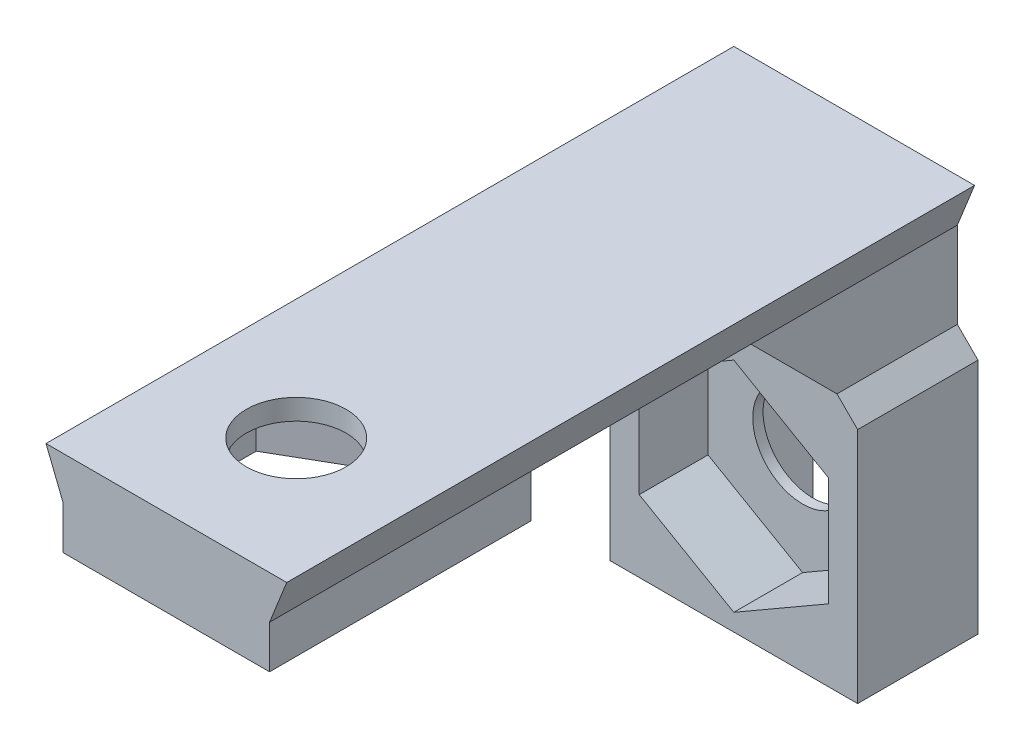
ISO-10303-21;
HEADER;
FILE_DESCRIPTION(('STEP AP214'),'2;1');
FILE_NAME('part.step','',(''),(''),'','','');
FILE_SCHEMA(('AUTOMOTIVE_DESIGN { 1 0 10303 214 1 1 1 1 }'));
ENDSEC;
DATA;
#1=APPLICATION_CONTEXT('core data for automotive mechanical design processes');
#2=APPLICATION_PROTOCOL_DEFINITION('international standard','automotive_design',2000,#1);
#3=PRODUCT_CONTEXT('',#1,'mechanical');
#4=PRODUCT('Part','Part','',(#3));
#5=PRODUCT_RELATED_PRODUCT_CATEGORY('part','',(#4));
#6=PRODUCT_DEFINITION_FORMATION('','',#4);
#7=PRODUCT_DEFINITION_CONTEXT('part definition',#1,'design');
#8=PRODUCT_DEFINITION('design','',#6,#7);
#9=PRODUCT_DEFINITION_SHAPE('','',#8);
#10=(LENGTH_UNIT() NAMED_UNIT(*) SI_UNIT(.MILLI.,.METRE.));
#11=(NAMED_UNIT(*) PLANE_ANGLE_UNIT() SI_UNIT($,.RADIAN.));
#12=(NAMED_UNIT(*) SI_UNIT($,.STERADIAN.) SOLID_ANGLE_UNIT());
#13=UNCERTAINTY_MEASURE_WITH_UNIT(LENGTH_MEASURE(1.E-05),#10,'distance_accuracy_value','');
#14=(GEOMETRIC_REPRESENTATION_CONTEXT(3) GLOBAL_UNCERTAINTY_ASSIGNED_CONTEXT((#13)) GLOBAL_UNIT_ASSIGNED_CONTEXT((#10,
#11,#12)) REPRESENTATION_CONTEXT('',''));
#15=CARTESIAN_POINT('',(0.,0.,0.));
#16=DIRECTION('',(0.,0.,1.));
#17=DIRECTION('',(1.,0.,0.));
#18=AXIS2_PLACEMENT_3D('',#15,#16,#17);
#19=CARTESIAN_POINT('',(-6.,20.,3.5));
#20=DIRECTION('',(0.,0.,-1.));
#21=DIRECTION('',(-1.,0.,0.));
#22=AXIS2_PLACEMENT_3D('',#19,#20,#21);
#23=PLANE('',#22);
#24=DIRECTION('',(-0.866025403784438,-0.5,0.));
#25=VECTOR('',#24,1.);
#26=CARTESIAN_POINT('',(0.,13.7008529610859,3.5));
#27=LINE('',#26,#25);
#28=CARTESIAN_POINT('',(0.,13.7008529610859,3.5));
#29=VERTEX_POINT('',#28);
#30=CARTESIAN_POINT('',(-5.50000000000001,10.5254264805429,3.5));
#31=VERTEX_POINT('',#30);
#32=EDGE_CURVE('E451',#29,#31,#27,.T.);
#33=ORIENTED_EDGE('',*,*,#32,.F.);
#34=DIRECTION('',(-0.866025403784439,0.499999999999999,0.));
#35=VECTOR('',#34,1.);
#36=CARTESIAN_POINT('',(5.50000000000001,10.525426480543,3.5));
#37=LINE('',#36,#35);
#38=CARTESIAN_POINT('',(5.50000000000001,10.525426480543,3.5));
#39=VERTEX_POINT('',#38);
#40=EDGE_CURVE('E448',#39,#29,#37,.T.);
#41=ORIENTED_EDGE('',*,*,#40,.F.);
#42=DIRECTION('',(0.,1.,0.));
#43=VECTOR('',#42,1.);
#44=CARTESIAN_POINT('',(5.5,4.17457351945706,3.5));
#45=LINE('',#44,#43);
#46=CARTESIAN_POINT('',(5.5,4.17457351945706,3.5));
#47=VERTEX_POINT('',#46);
#48=EDGE_CURVE('E347',#47,#39,#45,.T.);
#49=ORIENTED_EDGE('',*,*,#48,.F.);
#50=DIRECTION('',(0.866025403784438,0.500000000000002,0.));
#51=VECTOR('',#50,1.);
#52=CARTESIAN_POINT('',(0.,0.999147038914107,3.5));
#53=LINE('',#52,#51);
#54=CARTESIAN_POINT('',(0.,0.999147038914107,3.5));
#55=VERTEX_POINT('',#54);
#56=EDGE_CURVE('E462',#55,#47,#53,.T.);
#57=ORIENTED_EDGE('',*,*,#56,.F.);
#58=DIRECTION('',(0.866025403784439,-0.499999999999999,0.));
#59=VECTOR('',#58,1.);
#60=CARTESIAN_POINT('',(-5.50000000000001,4.17457351945705,3.5));
#61=LINE('',#60,#59);
#62=CARTESIAN_POINT('',(-5.50000000000001,4.17457351945705,3.5));
#63=VERTEX_POINT('',#62);
#64=EDGE_CURVE('E459',#63,#55,#61,.T.);
#65=ORIENTED_EDGE('',*,*,#64,.F.);
#66=DIRECTION('',(0.,-1.,0.));
#67=VECTOR('',#66,1.);
#68=CARTESIAN_POINT('',(-5.50000000000001,10.5254264805429,3.5));
#69=LINE('',#68,#67);
#70=EDGE_CURVE('E455',#31,#63,#69,.T.);
#71=ORIENTED_EDGE('',*,*,#70,.F.);
#72=EDGE_LOOP('',(#33,#41,#49,#57,#65,#71));
#73=FACE_BOUND('',#72,.T.);
#74=DIRECTION('',(1.,0.,0.));
#75=VECTOR('',#74,1.);
#76=CARTESIAN_POINT('',(-6.,15.,3.5));
#77=LINE('',#76,#75);
#78=CARTESIAN_POINT('',(-6.,15.,3.5));
#79=VERTEX_POINT('',#78);
#80=CARTESIAN_POINT('',(6.,15.,3.5));
#81=VERTEX_POINT('',#80);
#82=EDGE_CURVE('E236',#79,#81,#77,.T.);
#83=ORIENTED_EDGE('',*,*,#82,.F.);
#84=DIRECTION('',(0.707106781186548,0.707106781186548,0.));
#85=VECTOR('',#84,1.);
#86=CARTESIAN_POINT('',(-7.2,13.8,3.5));
#87=LINE('',#86,#85);
#88=CARTESIAN_POINT('',(-7.2,13.8,3.5));
#89=VERTEX_POINT('',#88);
#90=EDGE_CURVE('E246',#79,#89,#87,.F.);
#91=ORIENTED_EDGE('',*,*,#90,.T.);
#92=DIRECTION('',(0.,-1.,0.));
#93=VECTOR('',#92,1.);
#94=CARTESIAN_POINT('',(-7.2,15.,3.5));
#95=LINE('',#94,#93);
#96=CARTESIAN_POINT('',(-7.2,0.,3.5));
#97=VERTEX_POINT('',#96);
#98=EDGE_CURVE('E262',#89,#97,#95,.T.);
#99=ORIENTED_EDGE('',*,*,#98,.T.);
#100=DIRECTION('',(1.,0.,0.));
#101=VECTOR('',#100,1.);
#102=CARTESIAN_POINT('',(-6.,0.,3.5));
#103=LINE('',#102,#101);
#104=CARTESIAN_POINT('',(7.2,0.,3.5));
#105=VERTEX_POINT('',#104);
#106=EDGE_CURVE('E300',#97,#105,#103,.T.);
#107=ORIENTED_EDGE('',*,*,#106,.T.);
#108=DIRECTION('',(0.,-1.,0.));
#109=VECTOR('',#108,1.);
#110=CARTESIAN_POINT('',(7.2,15.,3.5));
#111=LINE('',#110,#109);
#112=CARTESIAN_POINT('',(7.2,13.8,3.5));
#113=VERTEX_POINT('',#112);
#114=EDGE_CURVE('E1030',#113,#105,#111,.T.);
#115=ORIENTED_EDGE('',*,*,#114,.F.);
#116=DIRECTION('',(-0.707106781186548,0.707106781186547,0.));
#117=VECTOR('',#116,1.);
#118=CARTESIAN_POINT('',(7.2,13.8,3.5));
#119=LINE('',#118,#117);
#120=EDGE_CURVE('E249',#113,#81,#119,.T.);
#121=ORIENTED_EDGE('',*,*,#120,.T.);
#122=EDGE_LOOP('',(#83,#91,#99,#107,#115,#121));
#123=FACE_BOUND('',#122,.T.);
#124=ADVANCED_FACE('F39',(#73,#123),#23,.F.);
#125=CARTESIAN_POINT('',(6.,20.,3.5));
#126=DIRECTION('',(-1.,0.,0.));
#127=DIRECTION('',(0.,0.,1.));
#128=AXIS2_PLACEMENT_3D('',#125,#126,#127);
#129=PLANE('',#128);
#130=DIRECTION('',(0.,0.,-1.));
#131=VECTOR('',#130,1.);
#132=CARTESIAN_POINT('',(6.,20.,3.5));
#133=LINE('',#132,#131);
#134=CARTESIAN_POINT('',(6.,20.,8.49999999999987));
#135=VERTEX_POINT('',#134);
#136=CARTESIAN_POINT('',(6.,20.,-3.5));
#137=VERTEX_POINT('',#136);
#138=EDGE_CURVE('E294',#135,#137,#133,.T.);
#139=ORIENTED_EDGE('',*,*,#138,.F.);
#140=DIRECTION('',(0.,-0.707106781186551,-0.707106781186544));
#141=VECTOR('',#140,1.);
#142=CARTESIAN_POINT('',(6.,25.0000000000002,13.5));
#143=LINE('',#142,#141);
#144=EDGE_CURVE('E242',#135,#81,#143,.T.);
#145=ORIENTED_EDGE('',*,*,#144,.T.);
#146=DIRECTION('',(0.,0.,-1.));
#147=VECTOR('',#146,1.);
#148=CARTESIAN_POINT('',(6.,15.,3.5));
#149=LINE('',#148,#147);
#150=CARTESIAN_POINT('',(6.,15.,-3.5));
#151=VERTEX_POINT('',#150);
#152=EDGE_CURVE('E292',#81,#151,#149,.T.);
#153=ORIENTED_EDGE('',*,*,#152,.T.);
#154=DIRECTION('',(0.,-1.,0.));
#155=VECTOR('',#154,1.);
#156=CARTESIAN_POINT('',(6.,20.,-3.5));
#157=LINE('',#156,#155);
#158=EDGE_CURVE('E277',#137,#151,#157,.T.);
#159=ORIENTED_EDGE('',*,*,#158,.F.);
#160=EDGE_LOOP('',(#139,#145,#153,#159));
#161=FACE_BOUND('',#160,.T.);
#162=ADVANCED_FACE('F290',(#161),#129,.F.);
#163=CARTESIAN_POINT('',(0.,17.5,0.));
#164=DIRECTION('',(0.,1.,0.));
#165=DIRECTION('',(0.,0.,1.));
#166=AXIS2_PLACEMENT_3D('',#163,#164,#165);
#167=PLANE('',#166);
#168=DIRECTION('',(0.,0.,-1.));
#169=VECTOR('',#168,1.);
#170=CARTESIAN_POINT('',(-6.,17.5,21.3));
#171=LINE('',#170,#169);
#172=CARTESIAN_POINT('',(-6.,17.5,36.5));
#173=VERTEX_POINT('',#172);
#174=CARTESIAN_POINT('',(-6.,17.5,21.3));
#175=VERTEX_POINT('',#174);
#176=EDGE_CURVE('E941',#173,#175,#171,.T.);
#177=ORIENTED_EDGE('',*,*,#176,.T.);
#178=DIRECTION('',(1.,0.,0.));
#179=VECTOR('',#178,1.);
#180=CARTESIAN_POINT('',(-6.,17.5,21.3));
#181=LINE('',#180,#179);
#182=CARTESIAN_POINT('',(6.,17.5,21.3));
#183=VERTEX_POINT('',#182);
#184=EDGE_CURVE('E945',#175,#183,#181,.T.);
#185=ORIENTED_EDGE('',*,*,#184,.T.);
#186=DIRECTION('',(0.,0.,1.));
#187=VECTOR('',#186,1.);
#188=CARTESIAN_POINT('',(6.,17.5,21.3));
#189=LINE('',#188,#187);
#190=CARTESIAN_POINT('',(6.,17.5,36.5));
#191=VERTEX_POINT('',#190);
#192=EDGE_CURVE('E948',#183,#191,#189,.T.);
#193=ORIENTED_EDGE('',*,*,#192,.T.);
#194=DIRECTION('',(-1.,0.,0.));
#195=VECTOR('',#194,1.);
#196=CARTESIAN_POINT('',(-6.,17.5,36.5));
#197=LINE('',#196,#195);
#198=EDGE_CURVE('E951',#191,#173,#197,.T.);
#199=ORIENTED_EDGE('',*,*,#198,.T.);
#200=EDGE_LOOP('',(#177,#185,#193,#199));
#201=FACE_BOUND('',#200,.T.);
#202=DIRECTION('',(0.866025403784439,0.,-0.5));
#203=VECTOR('',#202,1.);
#204=CARTESIAN_POINT('',(-5.5,17.5,25.7745735194571));
#205=LINE('',#204,#203);
#206=CARTESIAN_POINT('',(-5.5,17.5,25.7745735194571));
#207=VERTEX_POINT('',#206);
#208=CARTESIAN_POINT('',(0.,17.5,22.5991470389141));
#209=VERTEX_POINT('',#208);
#210=EDGE_CURVE('E903',#207,#209,#205,.T.);
#211=ORIENTED_EDGE('',*,*,#210,.F.);
#212=DIRECTION('',(0.,0.,-1.));
#213=VECTOR('',#212,1.);
#214=CARTESIAN_POINT('',(-5.5,17.5,32.1254264805429));
#215=LINE('',#214,#213);
#216=CARTESIAN_POINT('',(-5.5,17.5,32.1254264805429));
#217=VERTEX_POINT('',#216);
#218=EDGE_CURVE('E919',#217,#207,#215,.T.);
#219=ORIENTED_EDGE('',*,*,#218,.F.);
#220=DIRECTION('',(-0.866025403784439,0.,-0.5));
#221=VECTOR('',#220,1.);
#222=CARTESIAN_POINT('',(0.,17.5,35.3008529610859));
#223=LINE('',#222,#221);
#224=CARTESIAN_POINT('',(0.,17.5,35.3008529610859));
#225=VERTEX_POINT('',#224);
#226=EDGE_CURVE('E915',#225,#217,#223,.T.);
#227=ORIENTED_EDGE('',*,*,#226,.F.);
#228=DIRECTION('',(-0.866025403784438,0.,0.5));
#229=VECTOR('',#228,1.);
#230=CARTESIAN_POINT('',(5.5,17.5,32.1254264805429));
#231=LINE('',#230,#229);
#232=CARTESIAN_POINT('',(5.5,17.5,32.1254264805429));
#233=VERTEX_POINT('',#232);
#234=EDGE_CURVE('E912',#233,#225,#231,.T.);
#235=ORIENTED_EDGE('',*,*,#234,.F.);
#236=DIRECTION('',(0.,0.,1.));
#237=VECTOR('',#236,1.);
#238=CARTESIAN_POINT('',(5.50000000000001,17.5,25.7745735194571));
#239=LINE('',#238,#237);
#240=CARTESIAN_POINT('',(5.50000000000001,17.5,25.7745735194571));
#241=VERTEX_POINT('',#240);
#242=EDGE_CURVE('E909',#241,#233,#239,.T.);
#243=ORIENTED_EDGE('',*,*,#242,.F.);
#244=DIRECTION('',(0.866025403784439,0.,0.5));
#245=VECTOR('',#244,1.);
#246=CARTESIAN_POINT('',(0.,17.5,22.5991470389141));
#247=LINE('',#246,#245);
#248=EDGE_CURVE('E906',#209,#241,#247,.T.);
#249=ORIENTED_EDGE('',*,*,#248,.F.);
#250=EDGE_LOOP('',(#211,#219,#227,#235,#243,#249));
#251=FACE_BOUND('',#250,.T.);
#252=ADVANCED_FACE('F505',(#201,#251),#167,.F.);
#253=CARTESIAN_POINT('',(0.,20.,0.));
#254=DIRECTION('',(0.,1.,0.));
#255=DIRECTION('',(0.,0.,1.));
#256=AXIS2_PLACEMENT_3D('',#253,#254,#255);
#257=PLANE('',#256);
#258=DIRECTION('',(0.,0.,-1.));
#259=VECTOR('',#258,1.);
#260=CARTESIAN_POINT('',(-6.,20.,36.501));
#261=LINE('',#260,#259);
#262=CARTESIAN_POINT('',(-6.,20.,21.3));
#263=VERTEX_POINT('',#262);
#264=CARTESIAN_POINT('',(-6.,20.,8.49999999999988));
#265=VERTEX_POINT('',#264);
#266=EDGE_CURVE('E54',#263,#265,#261,.T.);
#267=ORIENTED_EDGE('',*,*,#266,.T.);
#268=DIRECTION('',(1.,0.,0.));
#269=VECTOR('',#268,1.);
#270=CARTESIAN_POINT('',(0.,20.,8.49999999999988));
#271=LINE('',#270,#269);
#272=EDGE_CURVE('E11',#265,#135,#271,.T.);
#273=ORIENTED_EDGE('',*,*,#272,.T.);
#274=CARTESIAN_POINT('',(6.,20.,21.3));
#275=VERTEX_POINT('',#274);
#276=EDGE_CURVE('E299',#275,#135,#133,.T.);
#277=ORIENTED_EDGE('',*,*,#276,.F.);
#278=DIRECTION('',(1.,0.,0.));
#279=VECTOR('',#278,1.);
#280=CARTESIAN_POINT('',(-6.,20.,21.3));
#281=LINE('',#280,#279);
#282=EDGE_CURVE('E940',#263,#275,#281,.T.);
#283=ORIENTED_EDGE('',*,*,#282,.F.);
#284=EDGE_LOOP('',(#267,#273,#277,#283));
#285=FACE_BOUND('',#284,.T.);
#286=ADVANCED_FACE('F576',(#285),#257,.F.);
#287=CARTESIAN_POINT('',(0.,7.35,-3.501));
#288=DIRECTION('',(0.,0.,1.));
#289=DIRECTION('',(1.,0.,0.));
#290=AXIS2_PLACEMENT_3D('',#287,#288,#289);
#291=CYLINDRICAL_SURFACE('',#290,2.9);
#292=CARTESIAN_POINT('',(0.,7.35,-1.1));
#293=DIRECTION('',(0.,0.,1.));
#294=DIRECTION('',(1.,0.,0.));
#295=AXIS2_PLACEMENT_3D('',#292,#293,#294);
#296=CIRCLE('',#295,2.9);
#297=CARTESIAN_POINT('',(2.9,7.35,-1.1));
#298=VERTEX_POINT('',#297);
#299=EDGE_CURVE('E329',#298,#298,#296,.F.);
#300=ORIENTED_EDGE('',*,*,#299,.T.);
#301=EDGE_LOOP('',(#300));
#302=FACE_BOUND('',#301,.T.);
#303=CARTESIAN_POINT('',(0.,7.35,-0.500000000000002));
#304=DIRECTION('',(0.,0.,1.));
#305=DIRECTION('',(1.,0.,0.));
#306=AXIS2_PLACEMENT_3D('',#303,#304,#305);
#307=CIRCLE('',#306,2.9);
#308=CARTESIAN_POINT('',(2.9,7.35,-0.500000000000002));
#309=VERTEX_POINT('',#308);
#310=EDGE_CURVE('E326',#309,#309,#307,.F.);
#311=ORIENTED_EDGE('',*,*,#310,.F.);
#312=EDGE_LOOP('',(#311));
#313=FACE_BOUND('',#312,.T.);
#314=ADVANCED_FACE('F514',(#302,#313),#291,.F.);
#315=CARTESIAN_POINT('',(-6.,20.,-3.5));
#316=DIRECTION('',(0.,0.,1.));
#317=DIRECTION('',(1.,0.,0.));
#318=AXIS2_PLACEMENT_3D('',#315,#316,#317);
#319=PLANE('',#318);
#320=ORIENTED_EDGE('',*,*,#158,.T.);
#321=DIRECTION('',(0.707106781186548,-0.707106781186547,0.));
#322=VECTOR('',#321,1.);
#323=CARTESIAN_POINT('',(7.2,13.8,-3.5));
#324=LINE('',#323,#322);
#325=CARTESIAN_POINT('',(7.2,13.8,-3.5));
#326=VERTEX_POINT('',#325);
#327=EDGE_CURVE('E283',#151,#326,#324,.T.);
#328=ORIENTED_EDGE('',*,*,#327,.T.);
#329=DIRECTION('',(0.,-1.,0.));
#330=VECTOR('',#329,1.);
#331=CARTESIAN_POINT('',(7.2,15.,-3.5));
#332=LINE('',#331,#330);
#333=CARTESIAN_POINT('',(7.2,0.,-3.5));
#334=VERTEX_POINT('',#333);
#335=EDGE_CURVE('E1031',#326,#334,#332,.T.);
#336=ORIENTED_EDGE('',*,*,#335,.T.);
#337=DIRECTION('',(-1.,0.,0.));
#338=VECTOR('',#337,1.);
#339=CARTESIAN_POINT('',(-6.,0.,-3.5));
#340=LINE('',#339,#338);
#341=CARTESIAN_POINT('',(2.4,0.,-3.5));
#342=VERTEX_POINT('',#341);
#343=EDGE_CURVE('E315',#334,#342,#340,.T.);
#344=ORIENTED_EDGE('',*,*,#343,.T.);
#345=DIRECTION('',(0.,1.,0.));
#346=VECTOR('',#345,1.);
#347=CARTESIAN_POINT('',(2.4,0.,-3.5));
#348=LINE('',#347,#346);
#349=CARTESIAN_POINT('',(2.4,20.,-3.5));
#350=VERTEX_POINT('',#349);
#351=EDGE_CURVE('E385',#342,#350,#348,.T.);
#352=ORIENTED_EDGE('',*,*,#351,.T.);
#353=DIRECTION('',(-1.,0.,0.));
#354=VECTOR('',#353,1.);
#355=CARTESIAN_POINT('',(-7.,20.,-3.5));
#356=LINE('',#355,#354);
#357=CARTESIAN_POINT('',(-2.4,20.,-3.5));
#358=VERTEX_POINT('',#357);
#359=EDGE_CURVE('E409',#350,#358,#356,.T.);
#360=ORIENTED_EDGE('',*,*,#359,.T.);
#361=DIRECTION('',(0.,1.,0.));
#362=VECTOR('',#361,1.);
#363=CARTESIAN_POINT('',(-2.4,0.,-3.5));
#364=LINE('',#363,#362);
#365=CARTESIAN_POINT('',(-2.4,0.,-3.5));
#366=VERTEX_POINT('',#365);
#367=EDGE_CURVE('E312',#366,#358,#364,.T.);
#368=ORIENTED_EDGE('',*,*,#367,.F.);
#369=CARTESIAN_POINT('',(-7.2,0.,-3.5));
#370=VERTEX_POINT('',#369);
#371=EDGE_CURVE('E319',#366,#370,#340,.T.);
#372=ORIENTED_EDGE('',*,*,#371,.T.);
#373=DIRECTION('',(0.,-1.,0.));
#374=VECTOR('',#373,1.);
#375=CARTESIAN_POINT('',(-7.2,15.,-3.5));
#376=LINE('',#375,#374);
#377=CARTESIAN_POINT('',(-7.2,13.8,-3.5));
#378=VERTEX_POINT('',#377);
#379=EDGE_CURVE('E864',#378,#370,#376,.T.);
#380=ORIENTED_EDGE('',*,*,#379,.F.);
#381=DIRECTION('',(-0.707106781186548,-0.707106781186548,0.));
#382=VECTOR('',#381,1.);
#383=CARTESIAN_POINT('',(-7.2,13.8,-3.5));
#384=LINE('',#383,#382);
#385=CARTESIAN_POINT('',(-6.,15.,-3.5));
#386=VERTEX_POINT('',#385);
#387=EDGE_CURVE('E274',#378,#386,#384,.F.);
#388=ORIENTED_EDGE('',*,*,#387,.T.);
#389=DIRECTION('',(0.,-1.,0.));
#390=VECTOR('',#389,1.);
#391=CARTESIAN_POINT('',(-6.,20.,-3.5));
#392=LINE('',#391,#390);
#393=CARTESIAN_POINT('',(-6.,20.,-3.5));
#394=VERTEX_POINT('',#393);
#395=EDGE_CURVE('E259',#394,#386,#392,.T.);
#396=ORIENTED_EDGE('',*,*,#395,.F.);
#397=DIRECTION('',(0.371390676354104,-0.928476690885259,0.));
#398=VECTOR('',#397,1.);
#399=CARTESIAN_POINT('',(-6.,20.,-3.5));
#400=LINE('',#399,#398);
#401=CARTESIAN_POINT('',(-7.,22.5,-3.5));
#402=VERTEX_POINT('',#401);
#403=EDGE_CURVE('E970',#402,#394,#400,.T.);
#404=ORIENTED_EDGE('',*,*,#403,.F.);
#405=DIRECTION('',(-1.,0.,0.));
#406=VECTOR('',#405,1.);
#407=CARTESIAN_POINT('',(-7.,22.5,-3.5));
#408=LINE('',#407,#406);
#409=CARTESIAN_POINT('',(7.,22.5,-3.5));
#410=VERTEX_POINT('',#409);
#411=EDGE_CURVE('E423',#410,#402,#408,.T.);
#412=ORIENTED_EDGE('',*,*,#411,.F.);
#413=DIRECTION('',(0.371390676354104,0.928476690885259,0.));
#414=VECTOR('',#413,1.);
#415=CARTESIAN_POINT('',(7.,22.5,-3.5));
#416=LINE('',#415,#414);
#417=EDGE_CURVE('E971',#137,#410,#416,.T.);
#418=ORIENTED_EDGE('',*,*,#417,.F.);
#419=EDGE_LOOP('',(#320,#328,#336,#344,#352,#360,#368,#372,#380,#388,#396,#404,#412,#418));
#420=FACE_BOUND('',#419,.T.);
#421=ADVANCED_FACE('F410',(#420),#319,.F.);
#422=CARTESIAN_POINT('',(-6.,20.,3.5));
#423=DIRECTION('',(1.,0.,0.));
#424=DIRECTION('',(0.,0.,-1.));
#425=AXIS2_PLACEMENT_3D('',#422,#423,#424);
#426=PLANE('',#425);
#427=DIRECTION('',(0.,0.,1.));
#428=VECTOR('',#427,1.);
#429=CARTESIAN_POINT('',(-6.,15.,3.5));
#430=LINE('',#429,#428);
#431=EDGE_CURVE('E256',#386,#79,#430,.T.);
#432=ORIENTED_EDGE('',*,*,#431,.T.);
#433=DIRECTION('',(0.,0.707106781186551,0.707106781186544));
#434=VECTOR('',#433,1.);
#435=CARTESIAN_POINT('',(-6.,25.0000000000002,13.5));
#436=LINE('',#435,#434);
#437=EDGE_CURVE('E48',#79,#265,#436,.T.);
#438=ORIENTED_EDGE('',*,*,#437,.T.);
#439=DIRECTION('',(0.,0.,1.));
#440=VECTOR('',#439,1.);
#441=CARTESIAN_POINT('',(-6.,20.,3.5));
#442=LINE('',#441,#440);
#443=EDGE_CURVE('E308',#394,#265,#442,.T.);
#444=ORIENTED_EDGE('',*,*,#443,.F.);
#445=ORIENTED_EDGE('',*,*,#395,.T.);
#446=EDGE_LOOP('',(#432,#438,#444,#445));
#447=FACE_BOUND('',#446,.T.);
#448=ADVANCED_FACE('F257',(#447),#426,.F.);
#449=CARTESIAN_POINT('',(0.,0.,0.));
#450=DIRECTION('',(0.,-1.,0.));
#451=DIRECTION('',(0.,0.,-1.));
#452=AXIS2_PLACEMENT_3D('',#449,#450,#451);
#453=PLANE('',#452);
#454=DIRECTION('',(-0.707106781186546,0.,-0.707106781186549));
#455=VECTOR('',#454,1.);
#456=CARTESIAN_POINT('',(2.4,0.,-3.5));
#457=LINE('',#456,#455);
#458=CARTESIAN_POINT('',(4.79999999999999,0.,-1.1));
#459=VERTEX_POINT('',#458);
#460=EDGE_CURVE('E372',#459,#342,#457,.T.);
#461=ORIENTED_EDGE('',*,*,#460,.T.);
#462=ORIENTED_EDGE('',*,*,#343,.F.);
#463=DIRECTION('',(0.,0.,1.));
#464=VECTOR('',#463,1.);
#465=CARTESIAN_POINT('',(7.2,0.,3.5));
#466=LINE('',#465,#464);
#467=EDGE_CURVE('E252',#334,#105,#466,.T.);
#468=ORIENTED_EDGE('',*,*,#467,.T.);
#469=ORIENTED_EDGE('',*,*,#106,.F.);
#470=DIRECTION('',(0.,0.,-1.));
#471=VECTOR('',#470,1.);
#472=CARTESIAN_POINT('',(-7.2,0.,3.5));
#473=LINE('',#472,#471);
#474=EDGE_CURVE('E263',#97,#370,#473,.T.);
#475=ORIENTED_EDGE('',*,*,#474,.T.);
#476=ORIENTED_EDGE('',*,*,#371,.F.);
#477=DIRECTION('',(-0.707106781186551,0.,0.707106781186544));
#478=VECTOR('',#477,1.);
#479=CARTESIAN_POINT('',(-2.4,0.,-3.5));
#480=LINE('',#479,#478);
#481=CARTESIAN_POINT('',(-4.80000000000002,0.,-1.1));
#482=VERTEX_POINT('',#481);
#483=EDGE_CURVE('E363',#366,#482,#480,.T.);
#484=ORIENTED_EDGE('',*,*,#483,.T.);
#485=DIRECTION('',(1.,0.,0.));
#486=VECTOR('',#485,1.);
#487=CARTESIAN_POINT('',(0.,0.,-1.1));
#488=LINE('',#487,#486);
#489=EDGE_CURVE('E367',#482,#459,#488,.T.);
#490=ORIENTED_EDGE('',*,*,#489,.T.);
#491=EDGE_LOOP('',(#461,#462,#468,#469,#475,#476,#484,#490));
#492=FACE_BOUND('',#491,.T.);
#493=ADVANCED_FACE('F509',(#492),#453,.T.);
#494=CARTESIAN_POINT('',(2.4,0.,-3.5));
#495=DIRECTION('',(0.707106781186549,0.,-0.707106781186546));
#496=DIRECTION('',(-0.707106781186546,0.,-0.707106781186549));
#497=AXIS2_PLACEMENT_3D('',#494,#495,#496);
#498=PLANE('',#497);
#499=DIRECTION('',(-0.707106781186546,0.,-0.707106781186549));
#500=VECTOR('',#499,1.);
#501=CARTESIAN_POINT('',(2.4,20.,-3.5));
#502=LINE('',#501,#500);
#503=CARTESIAN_POINT('',(4.79999999999999,20.,-1.1));
#504=VERTEX_POINT('',#503);
#505=EDGE_CURVE('E368',#504,#350,#502,.T.);
#506=ORIENTED_EDGE('',*,*,#505,.T.);
#507=ORIENTED_EDGE('',*,*,#351,.F.);
#508=ORIENTED_EDGE('',*,*,#460,.F.);
#509=DIRECTION('',(0.,1.,0.));
#510=VECTOR('',#509,1.);
#511=CARTESIAN_POINT('',(4.79999999999999,0.,-1.1));
#512=LINE('',#511,#510);
#513=EDGE_CURVE('E389',#459,#504,#512,.T.);
#514=ORIENTED_EDGE('',*,*,#513,.T.);
#515=EDGE_LOOP('',(#506,#507,#508,#514));
#516=FACE_BOUND('',#515,.T.);
#517=ADVANCED_FACE('F628',(#516),#498,.F.);
#518=CARTESIAN_POINT('',(0.,0.,-1.1));
#519=DIRECTION('',(0.,0.,1.));
#520=DIRECTION('',(1.,0.,0.));
#521=AXIS2_PLACEMENT_3D('',#518,#519,#520);
#522=PLANE('',#521);
#523=ORIENTED_EDGE('',*,*,#299,.F.);
#524=EDGE_LOOP('',(#523));
#525=FACE_BOUND('',#524,.T.);
#526=DIRECTION('',(1.,0.,0.));
#527=VECTOR('',#526,1.);
#528=CARTESIAN_POINT('',(0.,20.,-1.1));
#529=LINE('',#528,#527);
#530=CARTESIAN_POINT('',(-4.80000000000002,20.,-1.1));
#531=VERTEX_POINT('',#530);
#532=EDGE_CURVE('E379',#531,#504,#529,.T.);
#533=ORIENTED_EDGE('',*,*,#532,.T.);
#534=ORIENTED_EDGE('',*,*,#513,.F.);
#535=ORIENTED_EDGE('',*,*,#489,.F.);
#536=DIRECTION('',(0.,1.,0.));
#537=VECTOR('',#536,1.);
#538=CARTESIAN_POINT('',(-4.80000000000002,0.,-1.1));
#539=LINE('',#538,#537);
#540=EDGE_CURVE('E391',#482,#531,#539,.T.);
#541=ORIENTED_EDGE('',*,*,#540,.T.);
#542=EDGE_LOOP('',(#533,#534,#535,#541));
#543=FACE_BOUND('',#542,.T.);
#544=ADVANCED_FACE('F776',(#525,#543),#522,.F.);
#545=CARTESIAN_POINT('',(-2.4,0.,-3.5));
#546=DIRECTION('',(-0.707106781186544,0.,-0.707106781186551));
#547=DIRECTION('',(-0.707106781186551,0.,0.707106781186544));
#548=AXIS2_PLACEMENT_3D('',#545,#546,#547);
#549=PLANE('',#548);
#550=DIRECTION('',(-0.707106781186551,0.,0.707106781186544));
#551=VECTOR('',#550,1.);
#552=CARTESIAN_POINT('',(-2.4,20.,-3.5));
#553=LINE('',#552,#551);
#554=EDGE_CURVE('E336',#358,#531,#553,.T.);
#555=ORIENTED_EDGE('',*,*,#554,.T.);
#556=ORIENTED_EDGE('',*,*,#540,.F.);
#557=ORIENTED_EDGE('',*,*,#483,.F.);
#558=ORIENTED_EDGE('',*,*,#367,.T.);
#559=EDGE_LOOP('',(#555,#556,#557,#558));
#560=FACE_BOUND('',#559,.T.);
#561=ADVANCED_FACE('F399',(#560),#549,.F.);
#562=CARTESIAN_POINT('',(0.,0.,-0.500000000000002));
#563=DIRECTION('',(0.,0.,1.));
#564=DIRECTION('',(1.,0.,0.));
#565=AXIS2_PLACEMENT_3D('',#562,#563,#564);
#566=PLANE('',#565);
#567=DIRECTION('',(-0.866025403784439,0.499999999999999,0.));
#568=VECTOR('',#567,1.);
#569=CARTESIAN_POINT('',(5.50000000000001,10.525426480543,-0.500000000000002));
#570=LINE('',#569,#568);
#571=CARTESIAN_POINT('',(5.50000000000001,10.525426480543,-0.500000000000002));
#572=VERTEX_POINT('',#571);
#573=CARTESIAN_POINT('',(0.,13.7008529610859,-0.500000000000002));
#574=VERTEX_POINT('',#573);
#575=EDGE_CURVE('E425',#572,#574,#570,.T.);
#576=ORIENTED_EDGE('',*,*,#575,.T.);
#577=DIRECTION('',(-0.866025403784438,-0.5,0.));
#578=VECTOR('',#577,1.);
#579=CARTESIAN_POINT('',(0.,13.7008529610859,-0.500000000000002));
#580=LINE('',#579,#578);
#581=CARTESIAN_POINT('',(-5.50000000000001,10.5254264805429,-0.500000000000002));
#582=VERTEX_POINT('',#581);
#583=EDGE_CURVE('E429',#574,#582,#580,.T.);
#584=ORIENTED_EDGE('',*,*,#583,.T.);
#585=DIRECTION('',(0.,-1.,0.));
#586=VECTOR('',#585,1.);
#587=CARTESIAN_POINT('',(-5.50000000000001,10.5254264805429,-0.500000000000002));
#588=LINE('',#587,#586);
#589=CARTESIAN_POINT('',(-5.50000000000001,4.17457351945705,-0.500000000000002));
#590=VERTEX_POINT('',#589);
#591=EDGE_CURVE('E433',#582,#590,#588,.T.);
#592=ORIENTED_EDGE('',*,*,#591,.T.);
#593=DIRECTION('',(0.866025403784439,-0.499999999999999,0.));
#594=VECTOR('',#593,1.);
#595=CARTESIAN_POINT('',(-5.50000000000001,4.17457351945705,-0.500000000000002));
#596=LINE('',#595,#594);
#597=CARTESIAN_POINT('',(0.,0.999147038914107,-0.500000000000002));
#598=VERTEX_POINT('',#597);
#599=EDGE_CURVE('E437',#590,#598,#596,.T.);
#600=ORIENTED_EDGE('',*,*,#599,.T.);
#601=DIRECTION('',(0.866025403784438,0.500000000000002,0.));
#602=VECTOR('',#601,1.);
#603=CARTESIAN_POINT('',(0.,0.999147038914107,-0.500000000000002));
#604=LINE('',#603,#602);
#605=CARTESIAN_POINT('',(5.5,4.17457351945706,-0.500000000000002));
#606=VERTEX_POINT('',#605);
#607=EDGE_CURVE('E441',#598,#606,#604,.T.);
#608=ORIENTED_EDGE('',*,*,#607,.T.);
#609=DIRECTION('',(0.,1.,0.));
#610=VECTOR('',#609,1.);
#611=CARTESIAN_POINT('',(5.5,4.17457351945706,-0.500000000000002));
#612=LINE('',#611,#610);
#613=EDGE_CURVE('E361',#606,#572,#612,.T.);
#614=ORIENTED_EDGE('',*,*,#613,.T.);
#615=EDGE_LOOP('',(#576,#584,#592,#600,#608,#614));
#616=FACE_BOUND('',#615,.T.);
#617=ORIENTED_EDGE('',*,*,#310,.T.);
#618=EDGE_LOOP('',(#617));
#619=FACE_BOUND('',#618,.T.);
#620=ADVANCED_FACE('F482',(#616,#619),#566,.T.);
#621=CARTESIAN_POINT('',(5.50000000000001,10.525426480543,-0.500000000000002));
#622=DIRECTION('',(0.499999999999999,0.866025403784439,0.));
#623=DIRECTION('',(-0.866025403784439,0.499999999999999,0.));
#624=AXIS2_PLACEMENT_3D('',#621,#622,#623);
#625=PLANE('',#624);
#626=ORIENTED_EDGE('',*,*,#40,.T.);
#627=DIRECTION('',(0.,0.,1.));
#628=VECTOR('',#627,1.);
#629=CARTESIAN_POINT('',(0.,13.7008529610859,-0.500000000000002));
#630=LINE('',#629,#628);
#631=EDGE_CURVE('E358',#574,#29,#630,.T.);
#632=ORIENTED_EDGE('',*,*,#631,.F.);
#633=ORIENTED_EDGE('',*,*,#575,.F.);
#634=DIRECTION('',(0.,0.,1.));
#635=VECTOR('',#634,1.);
#636=CARTESIAN_POINT('',(5.50000000000001,10.525426480543,-0.500000000000002));
#637=LINE('',#636,#635);
#638=EDGE_CURVE('E330',#572,#39,#637,.T.);
#639=ORIENTED_EDGE('',*,*,#638,.T.);
#640=EDGE_LOOP('',(#626,#632,#633,#639));
#641=FACE_BOUND('',#640,.T.);
#642=ADVANCED_FACE('F476',(#641),#625,.F.);
#643=CARTESIAN_POINT('',(5.5,4.17457351945706,-0.500000000000002));
#644=DIRECTION('',(1.,0.,0.));
#645=DIRECTION('',(0.,1.,0.));
#646=AXIS2_PLACEMENT_3D('',#643,#644,#645);
#647=PLANE('',#646);
#648=ORIENTED_EDGE('',*,*,#48,.T.);
#649=ORIENTED_EDGE('',*,*,#638,.F.);
#650=ORIENTED_EDGE('',*,*,#613,.F.);
#651=DIRECTION('',(0.,0.,1.));
#652=VECTOR('',#651,1.);
#653=CARTESIAN_POINT('',(5.5,4.17457351945706,-0.500000000000002));
#654=LINE('',#653,#652);
#655=EDGE_CURVE('E338',#606,#47,#654,.T.);
#656=ORIENTED_EDGE('',*,*,#655,.T.);
#657=EDGE_LOOP('',(#648,#649,#650,#656));
#658=FACE_BOUND('',#657,.T.);
#659=ADVANCED_FACE('F471',(#658),#647,.F.);
#660=CARTESIAN_POINT('',(0.,0.999147038914107,-0.500000000000002));
#661=DIRECTION('',(0.500000000000002,-0.866025403784438,0.));
#662=DIRECTION('',(0.866025403784438,0.500000000000001,0.));
#663=AXIS2_PLACEMENT_3D('',#660,#661,#662);
#664=PLANE('',#663);
#665=ORIENTED_EDGE('',*,*,#56,.T.);
#666=ORIENTED_EDGE('',*,*,#655,.F.);
#667=ORIENTED_EDGE('',*,*,#607,.F.);
#668=DIRECTION('',(0.,0.,1.));
#669=VECTOR('',#668,1.);
#670=CARTESIAN_POINT('',(0.,0.999147038914107,-0.500000000000002));
#671=LINE('',#670,#669);
#672=EDGE_CURVE('E344',#598,#55,#671,.T.);
#673=ORIENTED_EDGE('',*,*,#672,.T.);
#674=EDGE_LOOP('',(#665,#666,#667,#673));
#675=FACE_BOUND('',#674,.T.);
#676=ADVANCED_FACE('F485',(#675),#664,.F.);
#677=CARTESIAN_POINT('',(-5.50000000000001,4.17457351945705,-0.500000000000002));
#678=DIRECTION('',(-0.499999999999999,-0.866025403784439,0.));
#679=DIRECTION('',(0.866025403784439,-0.499999999999999,0.));
#680=AXIS2_PLACEMENT_3D('',#677,#678,#679);
#681=PLANE('',#680);
#682=ORIENTED_EDGE('',*,*,#64,.T.);
#683=ORIENTED_EDGE('',*,*,#672,.F.);
#684=ORIENTED_EDGE('',*,*,#599,.F.);
#685=DIRECTION('',(0.,0.,1.));
#686=VECTOR('',#685,1.);
#687=CARTESIAN_POINT('',(-5.50000000000001,4.17457351945705,-0.500000000000002));
#688=LINE('',#687,#686);
#689=EDGE_CURVE('E352',#590,#63,#688,.T.);
#690=ORIENTED_EDGE('',*,*,#689,.T.);
#691=EDGE_LOOP('',(#682,#683,#684,#690));
#692=FACE_BOUND('',#691,.T.);
#693=ADVANCED_FACE('F488',(#692),#681,.F.);
#694=CARTESIAN_POINT('',(-5.50000000000001,10.5254264805429,-0.500000000000002));
#695=DIRECTION('',(-1.,0.,0.));
#696=DIRECTION('',(0.,-1.,0.));
#697=AXIS2_PLACEMENT_3D('',#694,#695,#696);
#698=PLANE('',#697);
#699=ORIENTED_EDGE('',*,*,#70,.T.);
#700=ORIENTED_EDGE('',*,*,#689,.F.);
#701=ORIENTED_EDGE('',*,*,#591,.F.);
#702=DIRECTION('',(0.,0.,1.));
#703=VECTOR('',#702,1.);
#704=CARTESIAN_POINT('',(-5.50000000000001,10.5254264805429,-0.500000000000002));
#705=LINE('',#704,#703);
#706=EDGE_CURVE('E355',#582,#31,#705,.T.);
#707=ORIENTED_EDGE('',*,*,#706,.T.);
#708=EDGE_LOOP('',(#699,#700,#701,#707));
#709=FACE_BOUND('',#708,.T.);
#710=ADVANCED_FACE('F490',(#709),#698,.F.);
#711=CARTESIAN_POINT('',(0.,13.7008529610859,-0.500000000000002));
#712=DIRECTION('',(-0.5,0.866025403784439,0.));
#713=DIRECTION('',(-0.866025403784438,-0.5,0.));
#714=AXIS2_PLACEMENT_3D('',#711,#712,#713);
#715=PLANE('',#714);
#716=ORIENTED_EDGE('',*,*,#32,.T.);
#717=ORIENTED_EDGE('',*,*,#706,.F.);
#718=ORIENTED_EDGE('',*,*,#583,.F.);
#719=ORIENTED_EDGE('',*,*,#631,.T.);
#720=EDGE_LOOP('',(#716,#717,#718,#719));
#721=FACE_BOUND('',#720,.T.);
#722=ADVANCED_FACE('F479',(#721),#715,.F.);
#723=CARTESIAN_POINT('',(-6.99999999999999,22.5,36.5));
#724=DIRECTION('',(0.,0.,-1.));
#725=DIRECTION('',(-1.,0.,0.));
#726=AXIS2_PLACEMENT_3D('',#723,#724,#725);
#727=PLANE('',#726);
#728=DIRECTION('',(-0.371390676354104,0.928476690885259,0.));
#729=VECTOR('',#728,1.);
#730=CARTESIAN_POINT('',(-6.,20.,36.5));
#731=LINE('',#730,#729);
#732=CARTESIAN_POINT('',(-6.,20.,36.5));
#733=VERTEX_POINT('',#732);
#734=CARTESIAN_POINT('',(-6.99999999999999,22.5,36.5));
#735=VERTEX_POINT('',#734);
#736=EDGE_CURVE('E974',#733,#735,#731,.T.);
#737=ORIENTED_EDGE('',*,*,#736,.F.);
#738=DIRECTION('',(0.,1.,0.));
#739=VECTOR('',#738,1.);
#740=CARTESIAN_POINT('',(-6.,17.5,36.5));
#741=LINE('',#740,#739);
#742=EDGE_CURVE('E954',#173,#733,#741,.T.);
#743=ORIENTED_EDGE('',*,*,#742,.F.);
#744=ORIENTED_EDGE('',*,*,#198,.F.);
#745=DIRECTION('',(0.,1.,0.));
#746=VECTOR('',#745,1.);
#747=CARTESIAN_POINT('',(6.,17.5,36.5));
#748=LINE('',#747,#746);
#749=CARTESIAN_POINT('',(6.,20.,36.5));
#750=VERTEX_POINT('',#749);
#751=EDGE_CURVE('E960',#191,#750,#748,.T.);
#752=ORIENTED_EDGE('',*,*,#751,.T.);
#753=DIRECTION('',(-0.371390676354104,-0.92847669088526,0.));
#754=VECTOR('',#753,1.);
#755=CARTESIAN_POINT('',(7.,22.5,36.5));
#756=LINE('',#755,#754);
#757=CARTESIAN_POINT('',(7.,22.5,36.5));
#758=VERTEX_POINT('',#757);
#759=EDGE_CURVE('E413',#758,#750,#756,.T.);
#760=ORIENTED_EDGE('',*,*,#759,.F.);
#761=DIRECTION('',(1.,0.,0.));
#762=VECTOR('',#761,1.);
#763=CARTESIAN_POINT('',(-6.99999999999999,22.5,36.5));
#764=LINE('',#763,#762);
#765=EDGE_CURVE('E418',#735,#758,#764,.T.);
#766=ORIENTED_EDGE('',*,*,#765,.F.);
#767=EDGE_LOOP('',(#737,#743,#744,#752,#760,#766));
#768=FACE_BOUND('',#767,.T.);
#769=ADVANCED_FACE('F497',(#768),#727,.F.);
#770=CARTESIAN_POINT('',(0.,22.5,0.));
#771=DIRECTION('',(0.,1.,0.));
#772=DIRECTION('',(0.,0.,1.));
#773=AXIS2_PLACEMENT_3D('',#770,#771,#772);
#774=PLANE('',#773);
#775=CARTESIAN_POINT('',(0.,22.5,28.95));
#776=DIRECTION('',(0.,1.,0.));
#777=DIRECTION('',(0.,0.,1.));
#778=AXIS2_PLACEMENT_3D('',#775,#776,#777);
#779=CIRCLE('',#778,2.9);
#780=CARTESIAN_POINT('',(0.,22.5,31.85));
#781=VERTEX_POINT('',#780);
#782=EDGE_CURVE('E866',#781,#781,#779,.F.);
#783=ORIENTED_EDGE('',*,*,#782,.T.);
#784=EDGE_LOOP('',(#783));
#785=FACE_BOUND('',#784,.T.);
#786=DIRECTION('',(0.,0.,1.));
#787=VECTOR('',#786,1.);
#788=CARTESIAN_POINT('',(-7.,22.5,-3.5));
#789=LINE('',#788,#787);
#790=EDGE_CURVE('E412',#402,#735,#789,.T.);
#791=ORIENTED_EDGE('',*,*,#790,.T.);
#792=ORIENTED_EDGE('',*,*,#765,.T.);
#793=DIRECTION('',(0.,0.,-1.));
#794=VECTOR('',#793,1.);
#795=CARTESIAN_POINT('',(7.,22.5,-3.5));
#796=LINE('',#795,#794);
#797=EDGE_CURVE('E987',#758,#410,#796,.T.);
#798=ORIENTED_EDGE('',*,*,#797,.T.);
#799=ORIENTED_EDGE('',*,*,#411,.T.);
#800=EDGE_LOOP('',(#791,#792,#798,#799));
#801=FACE_BOUND('',#800,.T.);
#802=ADVANCED_FACE('F655',(#785,#801),#774,.T.);
#803=ORIENTED_EDGE('',*,*,#505,.F.);
#804=ORIENTED_EDGE('',*,*,#532,.F.);
#805=ORIENTED_EDGE('',*,*,#554,.F.);
#806=ORIENTED_EDGE('',*,*,#359,.F.);
#807=EDGE_LOOP('',(#803,#804,#805,#806));
#808=FACE_BOUND('',#807,.T.);
#809=ADVANCED_FACE('F408',(#808),#257,.F.);
#810=CARTESIAN_POINT('',(-6.,20.,36.501));
#811=DIRECTION('',(0.928476690885259,0.371390676354104,0.));
#812=DIRECTION('',(-0.371390676354104,0.928476690885259,0.));
#813=AXIS2_PLACEMENT_3D('',#810,#811,#812);
#814=PLANE('',#813);
#815=ORIENTED_EDGE('',*,*,#736,.T.);
#816=ORIENTED_EDGE('',*,*,#790,.F.);
#817=ORIENTED_EDGE('',*,*,#403,.T.);
#818=ORIENTED_EDGE('',*,*,#443,.T.);
#819=ORIENTED_EDGE('',*,*,#266,.F.);
#820=EDGE_CURVE('E979',#733,#263,#261,.T.);
#821=ORIENTED_EDGE('',*,*,#820,.F.);
#822=EDGE_LOOP('',(#815,#816,#817,#818,#819,#821));
#823=FACE_BOUND('',#822,.T.);
#824=ADVANCED_FACE('F550',(#823),#814,.F.);
#825=CARTESIAN_POINT('',(7.,22.5,36.501));
#826=DIRECTION('',(-0.928476690885259,0.371390676354104,0.));
#827=DIRECTION('',(-0.371390676354104,-0.92847669088526,0.));
#828=AXIS2_PLACEMENT_3D('',#825,#826,#827);
#829=PLANE('',#828);
#830=ORIENTED_EDGE('',*,*,#759,.T.);
#831=DIRECTION('',(0.,0.,-1.));
#832=VECTOR('',#831,1.);
#833=CARTESIAN_POINT('',(6.,20.,36.501));
#834=LINE('',#833,#832);
#835=EDGE_CURVE('E305',#750,#275,#834,.T.);
#836=ORIENTED_EDGE('',*,*,#835,.T.);
#837=ORIENTED_EDGE('',*,*,#276,.T.);
#838=ORIENTED_EDGE('',*,*,#138,.T.);
#839=ORIENTED_EDGE('',*,*,#417,.T.);
#840=ORIENTED_EDGE('',*,*,#797,.F.);
#841=EDGE_LOOP('',(#830,#836,#837,#838,#839,#840));
#842=FACE_BOUND('',#841,.T.);
#843=ADVANCED_FACE('F304',(#842),#829,.F.);
#844=CARTESIAN_POINT('',(-6.,17.5,21.3));
#845=DIRECTION('',(1.,0.,0.));
#846=DIRECTION('',(0.,0.,-1.));
#847=AXIS2_PLACEMENT_3D('',#844,#845,#846);
#848=PLANE('',#847);
#849=ORIENTED_EDGE('',*,*,#820,.T.);
#850=DIRECTION('',(0.,1.,0.));
#851=VECTOR('',#850,1.);
#852=CARTESIAN_POINT('',(-6.,17.5,21.3));
#853=LINE('',#852,#851);
#854=EDGE_CURVE('E967',#175,#263,#853,.T.);
#855=ORIENTED_EDGE('',*,*,#854,.F.);
#856=ORIENTED_EDGE('',*,*,#176,.F.);
#857=ORIENTED_EDGE('',*,*,#742,.T.);
#858=EDGE_LOOP('',(#849,#855,#856,#857));
#859=FACE_BOUND('',#858,.T.);
#860=ADVANCED_FACE('F549',(#859),#848,.F.);
#861=CARTESIAN_POINT('',(-6.,17.5,21.3));
#862=DIRECTION('',(0.,0.,1.));
#863=DIRECTION('',(1.,0.,0.));
#864=AXIS2_PLACEMENT_3D('',#861,#862,#863);
#865=PLANE('',#864);
#866=ORIENTED_EDGE('',*,*,#282,.T.);
#867=DIRECTION('',(0.,1.,0.));
#868=VECTOR('',#867,1.);
#869=CARTESIAN_POINT('',(6.,17.5,21.3));
#870=LINE('',#869,#868);
#871=EDGE_CURVE('E964',#183,#275,#870,.T.);
#872=ORIENTED_EDGE('',*,*,#871,.F.);
#873=ORIENTED_EDGE('',*,*,#184,.F.);
#874=ORIENTED_EDGE('',*,*,#854,.T.);
#875=EDGE_LOOP('',(#866,#872,#873,#874));
#876=FACE_BOUND('',#875,.T.);
#877=ADVANCED_FACE('F737',(#876),#865,.F.);
#878=CARTESIAN_POINT('',(6.,17.5,21.3));
#879=DIRECTION('',(-1.,0.,0.));
#880=DIRECTION('',(0.,0.,1.));
#881=AXIS2_PLACEMENT_3D('',#878,#879,#880);
#882=PLANE('',#881);
#883=ORIENTED_EDGE('',*,*,#835,.F.);
#884=ORIENTED_EDGE('',*,*,#751,.F.);
#885=ORIENTED_EDGE('',*,*,#192,.F.);
#886=ORIENTED_EDGE('',*,*,#871,.T.);
#887=EDGE_LOOP('',(#883,#884,#885,#886));
#888=FACE_BOUND('',#887,.T.);
#889=ADVANCED_FACE('F719',(#888),#882,.F.);
#890=CARTESIAN_POINT('',(-5.5,17.5,25.7745735194571));
#891=DIRECTION('',(0.5,0.,0.866025403784439));
#892=DIRECTION('',(0.866025403784439,0.,-0.5));
#893=AXIS2_PLACEMENT_3D('',#890,#891,#892);
#894=PLANE('',#893);
#895=DIRECTION('',(0.,1.,0.));
#896=VECTOR('',#895,1.);
#897=CARTESIAN_POINT('',(-5.5,17.5,25.7745735194571));
#898=LINE('',#897,#896);
#899=CARTESIAN_POINT('',(-5.5,21.3,25.7745735194571));
#900=VERTEX_POINT('',#899);
#901=EDGE_CURVE('E922',#207,#900,#898,.T.);
#902=ORIENTED_EDGE('',*,*,#901,.F.);
#903=ORIENTED_EDGE('',*,*,#210,.T.);
#904=DIRECTION('',(0.,1.,0.));
#905=VECTOR('',#904,1.);
#906=CARTESIAN_POINT('',(0.,17.5,22.5991470389141));
#907=LINE('',#906,#905);
#908=CARTESIAN_POINT('',(0.,21.3,22.5991470389141));
#909=VERTEX_POINT('',#908);
#910=EDGE_CURVE('E937',#209,#909,#907,.T.);
#911=ORIENTED_EDGE('',*,*,#910,.T.);
#912=DIRECTION('',(0.866025403784439,0.,-0.5));
#913=VECTOR('',#912,1.);
#914=CARTESIAN_POINT('',(-5.5,21.3,25.7745735194571));
#915=LINE('',#914,#913);
#916=EDGE_CURVE('E878',#900,#909,#915,.T.);
#917=ORIENTED_EDGE('',*,*,#916,.F.);
#918=EDGE_LOOP('',(#902,#903,#911,#917));
#919=FACE_BOUND('',#918,.T.);
#920=ADVANCED_FACE('F709',(#919),#894,.T.);
#921=CARTESIAN_POINT('',(0.,17.5,22.5991470389141));
#922=DIRECTION('',(-0.5,0.,0.866025403784438));
#923=DIRECTION('',(0.866025403784439,0.,0.5));
#924=AXIS2_PLACEMENT_3D('',#921,#922,#923);
#925=PLANE('',#924);
#926=ORIENTED_EDGE('',*,*,#910,.F.);
#927=ORIENTED_EDGE('',*,*,#248,.T.);
#928=DIRECTION('',(0.,1.,0.));
#929=VECTOR('',#928,1.);
#930=CARTESIAN_POINT('',(5.50000000000001,17.5,25.7745735194571));
#931=LINE('',#930,#929);
#932=CARTESIAN_POINT('',(5.50000000000001,21.3,25.7745735194571));
#933=VERTEX_POINT('',#932);
#934=EDGE_CURVE('E934',#241,#933,#931,.T.);
#935=ORIENTED_EDGE('',*,*,#934,.T.);
#936=DIRECTION('',(0.866025403784439,0.,0.5));
#937=VECTOR('',#936,1.);
#938=CARTESIAN_POINT('',(0.,21.3,22.5991470389141));
#939=LINE('',#938,#937);
#940=EDGE_CURVE('E883',#909,#933,#939,.T.);
#941=ORIENTED_EDGE('',*,*,#940,.F.);
#942=EDGE_LOOP('',(#926,#927,#935,#941));
#943=FACE_BOUND('',#942,.T.);
#944=ADVANCED_FACE('F699',(#943),#925,.T.);
#945=CARTESIAN_POINT('',(5.50000000000001,17.5,25.7745735194571));
#946=DIRECTION('',(-1.,0.,0.));
#947=DIRECTION('',(0.,0.,1.));
#948=AXIS2_PLACEMENT_3D('',#945,#946,#947);
#949=PLANE('',#948);
#950=ORIENTED_EDGE('',*,*,#934,.F.);
#951=ORIENTED_EDGE('',*,*,#242,.T.);
#952=DIRECTION('',(0.,1.,0.));
#953=VECTOR('',#952,1.);
#954=CARTESIAN_POINT('',(5.5,17.5,32.1254264805429));
#955=LINE('',#954,#953);
#956=CARTESIAN_POINT('',(5.5,21.3,32.1254264805429));
#957=VERTEX_POINT('',#956);
#958=EDGE_CURVE('E931',#233,#957,#955,.T.);
#959=ORIENTED_EDGE('',*,*,#958,.T.);
#960=DIRECTION('',(0.,0.,1.));
#961=VECTOR('',#960,1.);
#962=CARTESIAN_POINT('',(5.50000000000001,21.3,25.7745735194571));
#963=LINE('',#962,#961);
#964=EDGE_CURVE('E887',#933,#957,#963,.T.);
#965=ORIENTED_EDGE('',*,*,#964,.F.);
#966=EDGE_LOOP('',(#950,#951,#959,#965));
#967=FACE_BOUND('',#966,.T.);
#968=ADVANCED_FACE('F689',(#967),#949,.T.);
#969=CARTESIAN_POINT('',(5.5,17.5,32.1254264805429));
#970=DIRECTION('',(-0.5,0.,-0.866025403784438));
#971=DIRECTION('',(-0.866025403784438,0.,0.5));
#972=AXIS2_PLACEMENT_3D('',#969,#970,#971);
#973=PLANE('',#972);
#974=ORIENTED_EDGE('',*,*,#958,.F.);
#975=ORIENTED_EDGE('',*,*,#234,.T.);
#976=DIRECTION('',(0.,1.,0.));
#977=VECTOR('',#976,1.);
#978=CARTESIAN_POINT('',(0.,17.5,35.3008529610859));
#979=LINE('',#978,#977);
#980=CARTESIAN_POINT('',(0.,21.3,35.3008529610859));
#981=VERTEX_POINT('',#980);
#982=EDGE_CURVE('E928',#225,#981,#979,.T.);
#983=ORIENTED_EDGE('',*,*,#982,.T.);
#984=DIRECTION('',(-0.866025403784438,0.,0.5));
#985=VECTOR('',#984,1.);
#986=CARTESIAN_POINT('',(5.5,21.3,32.1254264805429));
#987=LINE('',#986,#985);
#988=EDGE_CURVE('E891',#957,#981,#987,.T.);
#989=ORIENTED_EDGE('',*,*,#988,.F.);
#990=EDGE_LOOP('',(#974,#975,#983,#989));
#991=FACE_BOUND('',#990,.T.);
#992=ADVANCED_FACE('F679',(#991),#973,.T.);
#993=CARTESIAN_POINT('',(0.,17.5,35.3008529610859));
#994=DIRECTION('',(0.5,0.,-0.866025403784439));
#995=DIRECTION('',(-0.866025403784439,0.,-0.5));
#996=AXIS2_PLACEMENT_3D('',#993,#994,#995);
#997=PLANE('',#996);
#998=ORIENTED_EDGE('',*,*,#982,.F.);
#999=ORIENTED_EDGE('',*,*,#226,.T.);
#1000=DIRECTION('',(0.,1.,0.));
#1001=VECTOR('',#1000,1.);
#1002=CARTESIAN_POINT('',(-5.5,17.5,32.1254264805429));
#1003=LINE('',#1002,#1001);
#1004=CARTESIAN_POINT('',(-5.5,21.3,32.1254264805429));
#1005=VERTEX_POINT('',#1004);
#1006=EDGE_CURVE('E925',#217,#1005,#1003,.T.);
#1007=ORIENTED_EDGE('',*,*,#1006,.T.);
#1008=DIRECTION('',(-0.866025403784439,0.,-0.5));
#1009=VECTOR('',#1008,1.);
#1010=CARTESIAN_POINT('',(0.,21.3,35.3008529610859));
#1011=LINE('',#1010,#1009);
#1012=EDGE_CURVE('E895',#981,#1005,#1011,.T.);
#1013=ORIENTED_EDGE('',*,*,#1012,.F.);
#1014=EDGE_LOOP('',(#998,#999,#1007,#1013));
#1015=FACE_BOUND('',#1014,.T.);
#1016=ADVANCED_FACE('F669',(#1015),#997,.T.);
#1017=CARTESIAN_POINT('',(-5.5,17.5,32.1254264805429));
#1018=DIRECTION('',(1.,0.,0.));
#1019=DIRECTION('',(0.,0.,-1.));
#1020=AXIS2_PLACEMENT_3D('',#1017,#1018,#1019);
#1021=PLANE('',#1020);
#1022=ORIENTED_EDGE('',*,*,#1006,.F.);
#1023=ORIENTED_EDGE('',*,*,#218,.T.);
#1024=ORIENTED_EDGE('',*,*,#901,.T.);
#1025=DIRECTION('',(0.,0.,-1.));
#1026=VECTOR('',#1025,1.);
#1027=CARTESIAN_POINT('',(-5.5,21.3,32.1254264805429));
#1028=LINE('',#1027,#1026);
#1029=EDGE_CURVE('E899',#1005,#900,#1028,.T.);
#1030=ORIENTED_EDGE('',*,*,#1029,.F.);
#1031=EDGE_LOOP('',(#1022,#1023,#1024,#1030));
#1032=FACE_BOUND('',#1031,.T.);
#1033=ADVANCED_FACE('F647',(#1032),#1021,.T.);
#1034=CARTESIAN_POINT('',(0.,21.3,0.));
#1035=DIRECTION('',(0.,-1.,0.));
#1036=DIRECTION('',(0.,0.,-1.));
#1037=AXIS2_PLACEMENT_3D('',#1034,#1035,#1036);
#1038=PLANE('',#1037);
#1039=CARTESIAN_POINT('',(0.,21.3,28.95));
#1040=DIRECTION('',(0.,-1.,0.));
#1041=DIRECTION('',(0.,0.,-1.));
#1042=AXIS2_PLACEMENT_3D('',#1039,#1040,#1041);
#1043=CIRCLE('',#1042,2.9);
#1044=CARTESIAN_POINT('',(0.,21.3,26.05));
#1045=VERTEX_POINT('',#1044);
#1046=EDGE_CURVE('E871',#1045,#1045,#1043,.T.);
#1047=ORIENTED_EDGE('',*,*,#1046,.F.);
#1048=EDGE_LOOP('',(#1047));
#1049=FACE_BOUND('',#1048,.T.);
#1050=ORIENTED_EDGE('',*,*,#916,.T.);
#1051=ORIENTED_EDGE('',*,*,#940,.T.);
#1052=ORIENTED_EDGE('',*,*,#964,.T.);
#1053=ORIENTED_EDGE('',*,*,#988,.T.);
#1054=ORIENTED_EDGE('',*,*,#1012,.T.);
#1055=ORIENTED_EDGE('',*,*,#1029,.T.);
#1056=EDGE_LOOP('',(#1050,#1051,#1052,#1053,#1054,#1055));
#1057=FACE_BOUND('',#1056,.T.);
#1058=ADVANCED_FACE('F637',(#1049,#1057),#1038,.T.);
#1059=CARTESIAN_POINT('',(0.,22.501,28.95));
#1060=DIRECTION('',(0.,-1.,0.));
#1061=DIRECTION('',(0.,0.,-1.));
#1062=AXIS2_PLACEMENT_3D('',#1059,#1060,#1061);
#1063=CYLINDRICAL_SURFACE('',#1062,2.9);
#1064=ORIENTED_EDGE('',*,*,#782,.F.);
#1065=EDGE_LOOP('',(#1064));
#1066=FACE_BOUND('',#1065,.T.);
#1067=ORIENTED_EDGE('',*,*,#1046,.T.);
#1068=EDGE_LOOP('',(#1067));
#1069=FACE_BOUND('',#1068,.T.);
#1070=ADVANCED_FACE('F610',(#1066,#1069),#1063,.F.);
#1071=CARTESIAN_POINT('',(-7.2,15.,3.5));
#1072=DIRECTION('',(-1.,0.,0.));
#1073=DIRECTION('',(0.,0.,1.));
#1074=AXIS2_PLACEMENT_3D('',#1071,#1072,#1073);
#1075=PLANE('',#1074);
#1076=ORIENTED_EDGE('',*,*,#98,.F.);
#1077=DIRECTION('',(0.,0.,-1.));
#1078=VECTOR('',#1077,1.);
#1079=CARTESIAN_POINT('',(-7.2,13.8,3.5));
#1080=LINE('',#1079,#1078);
#1081=EDGE_CURVE('E268',#89,#378,#1080,.T.);
#1082=ORIENTED_EDGE('',*,*,#1081,.T.);
#1083=ORIENTED_EDGE('',*,*,#379,.T.);
#1084=ORIENTED_EDGE('',*,*,#474,.F.);
#1085=EDGE_LOOP('',(#1076,#1082,#1083,#1084));
#1086=FACE_BOUND('',#1085,.T.);
#1087=ADVANCED_FACE('F600',(#1086),#1075,.T.);
#1088=CARTESIAN_POINT('',(7.2,15.,3.5));
#1089=DIRECTION('',(1.,0.,0.));
#1090=DIRECTION('',(0.,0.,-1.));
#1091=AXIS2_PLACEMENT_3D('',#1088,#1089,#1090);
#1092=PLANE('',#1091);
#1093=ORIENTED_EDGE('',*,*,#335,.F.);
#1094=DIRECTION('',(0.,0.,1.));
#1095=VECTOR('',#1094,1.);
#1096=CARTESIAN_POINT('',(7.2,13.8,3.5));
#1097=LINE('',#1096,#1095);
#1098=EDGE_CURVE('E270',#326,#113,#1097,.T.);
#1099=ORIENTED_EDGE('',*,*,#1098,.T.);
#1100=ORIENTED_EDGE('',*,*,#114,.T.);
#1101=ORIENTED_EDGE('',*,*,#467,.F.);
#1102=EDGE_LOOP('',(#1093,#1099,#1100,#1101));
#1103=FACE_BOUND('',#1102,.T.);
#1104=ADVANCED_FACE('F518',(#1103),#1092,.T.);
#1105=CARTESIAN_POINT('',(7.2,13.8,3.5));
#1106=DIRECTION('',(0.707106781186547,0.707106781186548,0.));
#1107=DIRECTION('',(0.,0.,-1.));
#1108=AXIS2_PLACEMENT_3D('',#1105,#1106,#1107);
#1109=PLANE('',#1108);
#1110=ORIENTED_EDGE('',*,*,#327,.F.);
#1111=ORIENTED_EDGE('',*,*,#152,.F.);
#1112=ORIENTED_EDGE('',*,*,#120,.F.);
#1113=ORIENTED_EDGE('',*,*,#1098,.F.);
#1114=EDGE_LOOP('',(#1110,#1111,#1112,#1113));
#1115=FACE_BOUND('',#1114,.T.);
#1116=ADVANCED_FACE('F516',(#1115),#1109,.T.);
#1117=CARTESIAN_POINT('',(-7.2,13.8,3.5));
#1118=DIRECTION('',(0.707106781186548,-0.707106781186548,0.));
#1119=DIRECTION('',(0.,0.,-1.));
#1120=AXIS2_PLACEMENT_3D('',#1117,#1118,#1119);
#1121=PLANE('',#1120);
#1122=ORIENTED_EDGE('',*,*,#90,.F.);
#1123=ORIENTED_EDGE('',*,*,#431,.F.);
#1124=ORIENTED_EDGE('',*,*,#387,.F.);
#1125=ORIENTED_EDGE('',*,*,#1081,.F.);
#1126=EDGE_LOOP('',(#1122,#1123,#1124,#1125));
#1127=FACE_BOUND('',#1126,.T.);
#1128=ADVANCED_FACE('F266',(#1127),#1121,.F.);
#1129=CARTESIAN_POINT('',(0.,25.0000000000002,13.5));
#1130=DIRECTION('',(0.,-0.707106781186544,0.707106781186551));
#1131=DIRECTION('',(-1.,0.,0.));
#1132=AXIS2_PLACEMENT_3D('',#1129,#1130,#1131);
#1133=PLANE('',#1132);
#1134=ORIENTED_EDGE('',*,*,#437,.F.);
#1135=ORIENTED_EDGE('',*,*,#82,.T.);
#1136=ORIENTED_EDGE('',*,*,#144,.F.);
#1137=ORIENTED_EDGE('',*,*,#272,.F.);
#1138=EDGE_LOOP('',(#1134,#1135,#1136,#1137));
#1139=FACE_BOUND('',#1138,.T.);
#1140=ADVANCED_FACE('F41',(#1139),#1133,.T.);
#1141=CLOSED_SHELL('',(#124,#162,#252,#286,#314,#421,#448,#493,#517,#544,#561,#620,#642,#659,
#676,#693,#710,#722,#769,#802,#809,#824,#843,#860,#877,#889,#920,#944,#968,#992,#1016,#1033,
#1058,#1070,#1087,#1104,#1116,#1128,#1140));
#1142=MANIFOLD_SOLID_BREP('B2',#1141);
#1143=ADVANCED_BREP_SHAPE_REPRESENTATION('',(#18,#1142),#14);
#1144=SHAPE_DEFINITION_REPRESENTATION(#9,#1143);
ENDSEC;
END-ISO-10303-21;
